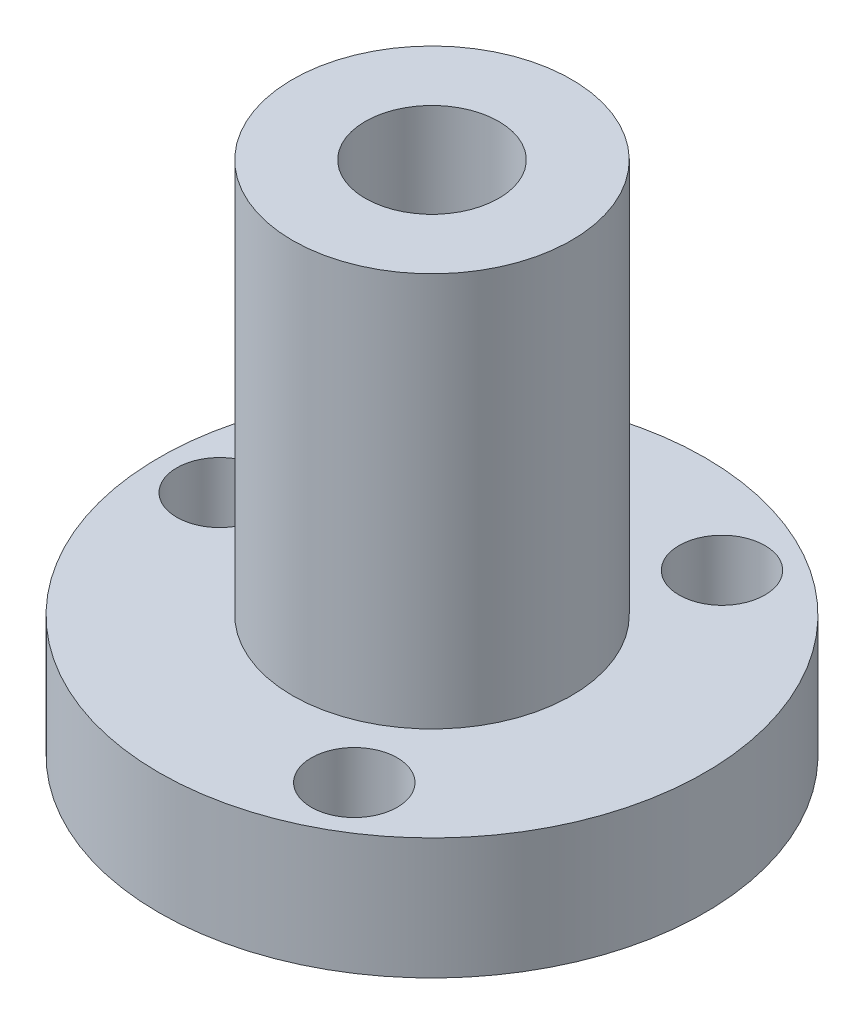
ISO-10303-21;
HEADER;
FILE_DESCRIPTION(('STEP AP214'),'2;1');
FILE_NAME('part.step','',(''),(''),'','','');
FILE_SCHEMA(('AUTOMOTIVE_DESIGN { 1 0 10303 214 1 1 1 1 }'));
ENDSEC;
DATA;
#1=APPLICATION_CONTEXT('core data for automotive mechanical design processes');
#2=APPLICATION_PROTOCOL_DEFINITION('international standard','automotive_design',2000,#1);
#3=PRODUCT_CONTEXT('',#1,'mechanical');
#4=PRODUCT('Part','Part','',(#3));
#5=PRODUCT_RELATED_PRODUCT_CATEGORY('part','',(#4));
#6=PRODUCT_DEFINITION_FORMATION('','',#4);
#7=PRODUCT_DEFINITION_CONTEXT('part definition',#1,'design');
#8=PRODUCT_DEFINITION('design','',#6,#7);
#9=PRODUCT_DEFINITION_SHAPE('','',#8);
#10=(LENGTH_UNIT() NAMED_UNIT(*) SI_UNIT(.MILLI.,.METRE.));
#11=(NAMED_UNIT(*) PLANE_ANGLE_UNIT() SI_UNIT($,.RADIAN.));
#12=(NAMED_UNIT(*) SI_UNIT($,.STERADIAN.) SOLID_ANGLE_UNIT());
#13=UNCERTAINTY_MEASURE_WITH_UNIT(LENGTH_MEASURE(1.E-05),#10,'distance_accuracy_value','');
#14=(GEOMETRIC_REPRESENTATION_CONTEXT(3) GLOBAL_UNCERTAINTY_ASSIGNED_CONTEXT((#13)) GLOBAL_UNIT_ASSIGNED_CONTEXT((#10,
#11,#12)) REPRESENTATION_CONTEXT('',''));
#15=CARTESIAN_POINT('',(0.,0.,0.));
#16=DIRECTION('',(0.,0.,1.));
#17=DIRECTION('',(1.,0.,0.));
#18=AXIS2_PLACEMENT_3D('',#15,#16,#17);
#19=CARTESIAN_POINT('',(0.,6.35,0.));
#20=DIRECTION('',(0.,1.,0.));
#21=DIRECTION('',(0.,0.,1.));
#22=AXIS2_PLACEMENT_3D('',#19,#20,#21);
#23=PLANE('',#22);
#24=CARTESIAN_POINT('',(-11.1125,6.35,0.));
#25=DIRECTION('',(0.,1.,0.));
#26=DIRECTION('',(0.,0.,1.));
#27=AXIS2_PLACEMENT_3D('',#24,#25,#26);
#28=CIRCLE('',#27,2.24789999999999);
#29=CARTESIAN_POINT('',(-11.1125,6.35,2.24789999999999));
#30=VERTEX_POINT('',#29);
#31=EDGE_CURVE('E66',#30,#30,#28,.T.);
#32=ORIENTED_EDGE('',*,*,#31,.F.);
#33=EDGE_LOOP('',(#32));
#34=FACE_BOUND('',#33,.T.);
#35=CARTESIAN_POINT('',(5.55624999999999,6.35,9.62370729955458));
#36=DIRECTION('',(0.,1.,0.));
#37=DIRECTION('',(0.,0.,1.));
#38=AXIS2_PLACEMENT_3D('',#35,#36,#37);
#39=CIRCLE('',#38,2.24789999999999);
#40=CARTESIAN_POINT('',(5.55624999999999,6.35,11.8716072995546));
#41=VERTEX_POINT('',#40);
#42=EDGE_CURVE('E60',#41,#41,#39,.T.);
#43=ORIENTED_EDGE('',*,*,#42,.F.);
#44=EDGE_LOOP('',(#43));
#45=FACE_BOUND('',#44,.T.);
#46=CARTESIAN_POINT('',(5.55625,6.35,-9.62370729955457));
#47=DIRECTION('',(0.,1.,0.));
#48=DIRECTION('',(0.,0.,1.));
#49=AXIS2_PLACEMENT_3D('',#46,#47,#48);
#50=CIRCLE('',#49,2.24789999999999);
#51=CARTESIAN_POINT('',(5.55625,6.35,-7.37580729955458));
#52=VERTEX_POINT('',#51);
#53=EDGE_CURVE('E52',#52,#52,#50,.T.);
#54=ORIENTED_EDGE('',*,*,#53,.F.);
#55=EDGE_LOOP('',(#54));
#56=FACE_BOUND('',#55,.T.);
#57=CARTESIAN_POINT('',(0.,6.35,0.));
#58=DIRECTION('',(0.,1.,0.));
#59=DIRECTION('',(0.,0.,1.));
#60=AXIS2_PLACEMENT_3D('',#57,#58,#59);
#61=CIRCLE('',#60,14.2875);
#62=CARTESIAN_POINT('',(0.,6.35,14.2875));
#63=VERTEX_POINT('',#62);
#64=EDGE_CURVE('E10',#63,#63,#61,.T.);
#65=ORIENTED_EDGE('',*,*,#64,.T.);
#66=EDGE_LOOP('',(#65));
#67=FACE_BOUND('',#66,.T.);
#68=CARTESIAN_POINT('',(0.,6.35,0.));
#69=DIRECTION('',(0.,1.,0.));
#70=DIRECTION('',(0.,0.,1.));
#71=AXIS2_PLACEMENT_3D('',#68,#69,#70);
#72=CIRCLE('',#71,7.3025);
#73=CARTESIAN_POINT('',(0.,6.35,7.3025));
#74=VERTEX_POINT('',#73);
#75=EDGE_CURVE('E43',#74,#74,#72,.T.);
#76=ORIENTED_EDGE('',*,*,#75,.F.);
#77=EDGE_LOOP('',(#76));
#78=FACE_BOUND('',#77,.T.);
#79=ADVANCED_FACE('F30',(#34,#45,#56,#67,#78),#23,.T.);
#80=CARTESIAN_POINT('',(0.,6.35,0.));
#81=DIRECTION('',(0.,-1.,0.));
#82=DIRECTION('',(0.,0.,-1.));
#83=AXIS2_PLACEMENT_3D('',#80,#81,#82);
#84=CYLINDRICAL_SURFACE('',#83,14.2875);
#85=ORIENTED_EDGE('',*,*,#64,.F.);
#86=EDGE_LOOP('',(#85));
#87=FACE_BOUND('',#86,.T.);
#88=CARTESIAN_POINT('',(0.,0.,0.));
#89=DIRECTION('',(0.,1.,0.));
#90=DIRECTION('',(0.,0.,1.));
#91=AXIS2_PLACEMENT_3D('',#88,#89,#90);
#92=CIRCLE('',#91,14.2875);
#93=CARTESIAN_POINT('',(0.,0.,14.2875));
#94=VERTEX_POINT('',#93);
#95=EDGE_CURVE('E34',#94,#94,#92,.T.);
#96=ORIENTED_EDGE('',*,*,#95,.T.);
#97=EDGE_LOOP('',(#96));
#98=FACE_BOUND('',#97,.T.);
#99=ADVANCED_FACE('F32',(#87,#98),#84,.T.);
#100=CARTESIAN_POINT('',(0.,0.,0.));
#101=DIRECTION('',(0.,1.,0.));
#102=DIRECTION('',(0.,0.,1.));
#103=AXIS2_PLACEMENT_3D('',#100,#101,#102);
#104=PLANE('',#103);
#105=CARTESIAN_POINT('',(-11.1125,0.,0.));
#106=DIRECTION('',(0.,-1.,0.));
#107=DIRECTION('',(0.,0.,-1.));
#108=AXIS2_PLACEMENT_3D('',#105,#106,#107);
#109=CIRCLE('',#108,2.24789999999999);
#110=CARTESIAN_POINT('',(-11.1125,0.,-2.24789999999999));
#111=VERTEX_POINT('',#110);
#112=EDGE_CURVE('E69',#111,#111,#109,.T.);
#113=ORIENTED_EDGE('',*,*,#112,.F.);
#114=EDGE_LOOP('',(#113));
#115=FACE_BOUND('',#114,.T.);
#116=CARTESIAN_POINT('',(5.55624999999999,0.,9.62370729955458));
#117=DIRECTION('',(0.,-1.,0.));
#118=DIRECTION('',(0.,0.,-1.));
#119=AXIS2_PLACEMENT_3D('',#116,#117,#118);
#120=CIRCLE('',#119,2.24789999999999);
#121=CARTESIAN_POINT('',(5.55624999999999,0.,7.37580729955459));
#122=VERTEX_POINT('',#121);
#123=EDGE_CURVE('E63',#122,#122,#120,.T.);
#124=ORIENTED_EDGE('',*,*,#123,.F.);
#125=EDGE_LOOP('',(#124));
#126=FACE_BOUND('',#125,.T.);
#127=CARTESIAN_POINT('',(5.55625,0.,-9.62370729955457));
#128=DIRECTION('',(0.,-1.,0.));
#129=DIRECTION('',(0.,0.,-1.));
#130=AXIS2_PLACEMENT_3D('',#127,#128,#129);
#131=CIRCLE('',#130,2.24789999999999);
#132=CARTESIAN_POINT('',(5.55625,0.,-11.8716072995546));
#133=VERTEX_POINT('',#132);
#134=EDGE_CURVE('E57',#133,#133,#131,.T.);
#135=ORIENTED_EDGE('',*,*,#134,.F.);
#136=EDGE_LOOP('',(#135));
#137=FACE_BOUND('',#136,.T.);
#138=CARTESIAN_POINT('',(0.,0.,0.));
#139=DIRECTION('',(0.,-1.,0.));
#140=DIRECTION('',(0.,0.,-1.));
#141=AXIS2_PLACEMENT_3D('',#138,#139,#140);
#142=CIRCLE('',#141,3.4925);
#143=CARTESIAN_POINT('',(0.,0.,-3.4925));
#144=VERTEX_POINT('',#143);
#145=EDGE_CURVE('E46',#144,#144,#142,.T.);
#146=ORIENTED_EDGE('',*,*,#145,.F.);
#147=EDGE_LOOP('',(#146));
#148=FACE_BOUND('',#147,.T.);
#149=ORIENTED_EDGE('',*,*,#95,.F.);
#150=EDGE_LOOP('',(#149));
#151=FACE_BOUND('',#150,.T.);
#152=ADVANCED_FACE('F75',(#115,#126,#137,#148,#151),#104,.F.);
#153=CARTESIAN_POINT('',(0.,26.9875,0.));
#154=DIRECTION('',(0.,-1.,0.));
#155=DIRECTION('',(0.,0.,-1.));
#156=AXIS2_PLACEMENT_3D('',#153,#154,#155);
#157=CYLINDRICAL_SURFACE('',#156,7.3025);
#158=CARTESIAN_POINT('',(0.,26.9875,0.));
#159=DIRECTION('',(0.,1.,0.));
#160=DIRECTION('',(0.,0.,1.));
#161=AXIS2_PLACEMENT_3D('',#158,#159,#160);
#162=CIRCLE('',#161,7.3025);
#163=CARTESIAN_POINT('',(0.,26.9875,7.3025));
#164=VERTEX_POINT('',#163);
#165=EDGE_CURVE('E41',#164,#164,#162,.T.);
#166=ORIENTED_EDGE('',*,*,#165,.F.);
#167=EDGE_LOOP('',(#166));
#168=FACE_BOUND('',#167,.T.);
#169=ORIENTED_EDGE('',*,*,#75,.T.);
#170=EDGE_LOOP('',(#169));
#171=FACE_BOUND('',#170,.T.);
#172=ADVANCED_FACE('F78',(#168,#171),#157,.T.);
#173=CARTESIAN_POINT('',(0.,26.9875,0.));
#174=DIRECTION('',(0.,1.,0.));
#175=DIRECTION('',(0.,0.,1.));
#176=AXIS2_PLACEMENT_3D('',#173,#174,#175);
#177=PLANE('',#176);
#178=CARTESIAN_POINT('',(0.,26.9875,0.));
#179=DIRECTION('',(0.,1.,0.));
#180=DIRECTION('',(0.,0.,1.));
#181=AXIS2_PLACEMENT_3D('',#178,#179,#180);
#182=CIRCLE('',#181,3.4925);
#183=CARTESIAN_POINT('',(0.,26.9875,3.4925));
#184=VERTEX_POINT('',#183);
#185=EDGE_CURVE('E49',#184,#184,#182,.F.);
#186=ORIENTED_EDGE('',*,*,#185,.T.);
#187=EDGE_LOOP('',(#186));
#188=FACE_BOUND('',#187,.T.);
#189=ORIENTED_EDGE('',*,*,#165,.T.);
#190=EDGE_LOOP('',(#189));
#191=FACE_BOUND('',#190,.T.);
#192=ADVANCED_FACE('F101',(#188,#191),#177,.T.);
#193=CARTESIAN_POINT('',(0.,26.9885,0.));
#194=DIRECTION('',(0.,-1.,0.));
#195=DIRECTION('',(0.,0.,-1.));
#196=AXIS2_PLACEMENT_3D('',#193,#194,#195);
#197=CYLINDRICAL_SURFACE('',#196,3.4925);
#198=ORIENTED_EDGE('',*,*,#185,.F.);
#199=EDGE_LOOP('',(#198));
#200=FACE_BOUND('',#199,.T.);
#201=ORIENTED_EDGE('',*,*,#145,.T.);
#202=EDGE_LOOP('',(#201));
#203=FACE_BOUND('',#202,.T.);
#204=ADVANCED_FACE('F105',(#200,#203),#197,.F.);
#205=CARTESIAN_POINT('',(5.55625,0.,-9.62370729955457));
#206=DIRECTION('',(0.,-1.,0.));
#207=DIRECTION('',(0.,0.,-1.));
#208=AXIS2_PLACEMENT_3D('',#205,#206,#207);
#209=CYLINDRICAL_SURFACE('',#208,2.24789999999999);
#210=ORIENTED_EDGE('',*,*,#53,.T.);
#211=EDGE_LOOP('',(#210));
#212=FACE_BOUND('',#211,.T.);
#213=ORIENTED_EDGE('',*,*,#134,.T.);
#214=EDGE_LOOP('',(#213));
#215=FACE_BOUND('',#214,.T.);
#216=ADVANCED_FACE('F109',(#212,#215),#209,.F.);
#217=CARTESIAN_POINT('',(5.55624999999999,0.,9.62370729955458));
#218=DIRECTION('',(0.,-1.,0.));
#219=DIRECTION('',(0.,0.,-1.));
#220=AXIS2_PLACEMENT_3D('',#217,#218,#219);
#221=CYLINDRICAL_SURFACE('',#220,2.24789999999999);
#222=ORIENTED_EDGE('',*,*,#42,.T.);
#223=EDGE_LOOP('',(#222));
#224=FACE_BOUND('',#223,.T.);
#225=ORIENTED_EDGE('',*,*,#123,.T.);
#226=EDGE_LOOP('',(#225));
#227=FACE_BOUND('',#226,.T.);
#228=ADVANCED_FACE('F113',(#224,#227),#221,.F.);
#229=CARTESIAN_POINT('',(-11.1125,0.,0.));
#230=DIRECTION('',(0.,-1.,0.));
#231=DIRECTION('',(0.,0.,-1.));
#232=AXIS2_PLACEMENT_3D('',#229,#230,#231);
#233=CYLINDRICAL_SURFACE('',#232,2.24789999999999);
#234=ORIENTED_EDGE('',*,*,#31,.T.);
#235=EDGE_LOOP('',(#234));
#236=FACE_BOUND('',#235,.T.);
#237=ORIENTED_EDGE('',*,*,#112,.T.);
#238=EDGE_LOOP('',(#237));
#239=FACE_BOUND('',#238,.T.);
#240=ADVANCED_FACE('F73',(#236,#239),#233,.F.);
#241=CLOSED_SHELL('',(#79,#99,#152,#172,#192,#204,#216,#228,#240));
#242=MANIFOLD_SOLID_BREP('B2',#241);
#243=ADVANCED_BREP_SHAPE_REPRESENTATION('',(#18,#242),#14);
#244=SHAPE_DEFINITION_REPRESENTATION(#9,#243);
ENDSEC;
END-ISO-10303-21;
